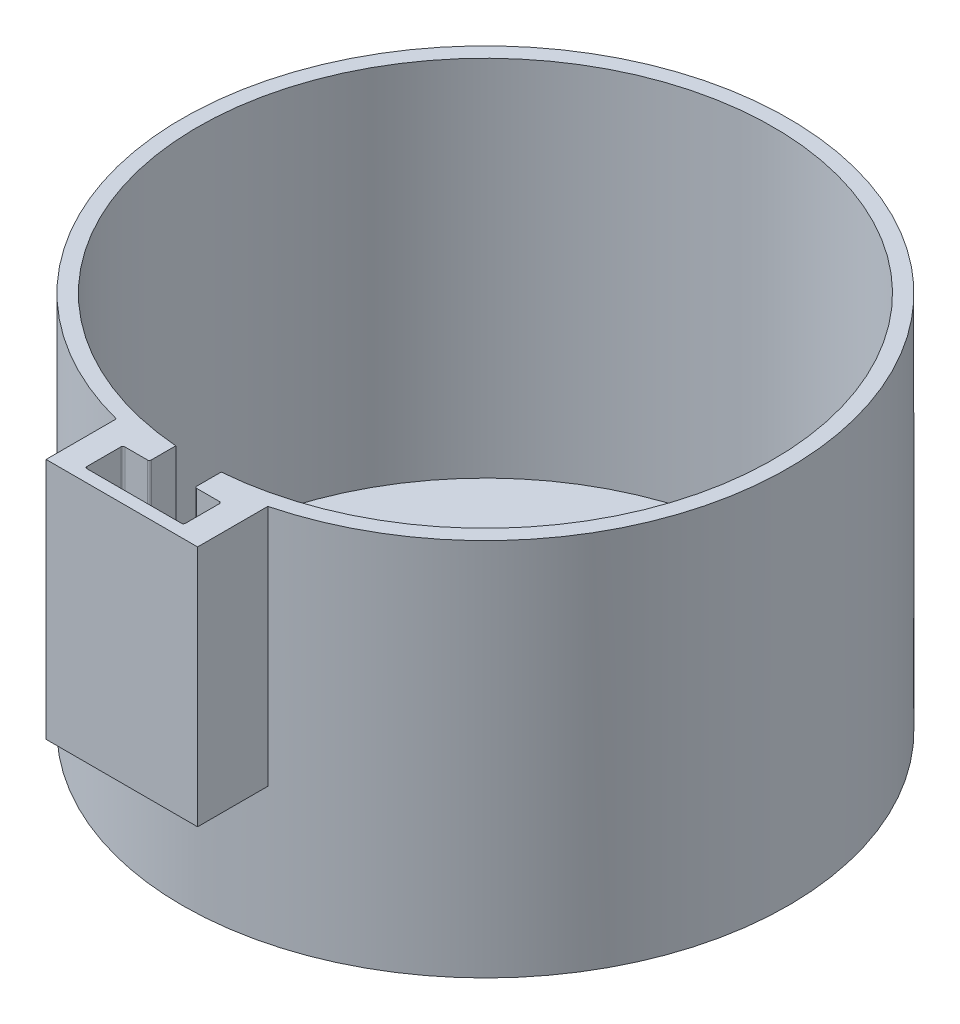
ISO-10303-21;
HEADER;
FILE_DESCRIPTION(('STEP AP214'),'2;1');
FILE_NAME('part.step','',(''),(''),'','','');
FILE_SCHEMA(('AUTOMOTIVE_DESIGN { 1 0 10303 214 1 1 1 1 }'));
ENDSEC;
DATA;
#1=APPLICATION_CONTEXT('core data for automotive mechanical design processes');
#2=APPLICATION_PROTOCOL_DEFINITION('international standard','automotive_design',2000,#1);
#3=PRODUCT_CONTEXT('',#1,'mechanical');
#4=PRODUCT('Part','Part','',(#3));
#5=PRODUCT_RELATED_PRODUCT_CATEGORY('part','',(#4));
#6=PRODUCT_DEFINITION_FORMATION('','',#4);
#7=PRODUCT_DEFINITION_CONTEXT('part definition',#1,'design');
#8=PRODUCT_DEFINITION('design','',#6,#7);
#9=PRODUCT_DEFINITION_SHAPE('','',#8);
#10=(LENGTH_UNIT() NAMED_UNIT(*) SI_UNIT(.MILLI.,.METRE.));
#11=(NAMED_UNIT(*) PLANE_ANGLE_UNIT() SI_UNIT($,.RADIAN.));
#12=(NAMED_UNIT(*) SI_UNIT($,.STERADIAN.) SOLID_ANGLE_UNIT());
#13=UNCERTAINTY_MEASURE_WITH_UNIT(LENGTH_MEASURE(1.E-05),#10,'distance_accuracy_value','');
#14=(GEOMETRIC_REPRESENTATION_CONTEXT(3) GLOBAL_UNCERTAINTY_ASSIGNED_CONTEXT((#13)) GLOBAL_UNIT_ASSIGNED_CONTEXT((#10,
#11,#12)) REPRESENTATION_CONTEXT('',''));
#15=CARTESIAN_POINT('',(0.,0.,0.));
#16=DIRECTION('',(0.,0.,1.));
#17=DIRECTION('',(1.,0.,0.));
#18=AXIS2_PLACEMENT_3D('',#15,#16,#17);
#19=CARTESIAN_POINT('',(0.,40.,0.));
#20=DIRECTION('',(0.,-1.,0.));
#21=DIRECTION('',(0.,0.,-1.));
#22=AXIS2_PLACEMENT_3D('',#19,#20,#21);
#23=CYLINDRICAL_SURFACE('',#22,40.);
#24=CARTESIAN_POINT('',(0.,0.,0.));
#25=DIRECTION('',(0.,1.,0.));
#26=DIRECTION('',(0.,0.,1.));
#27=AXIS2_PLACEMENT_3D('',#24,#25,#26);
#28=CIRCLE('',#27,40.);
#29=CARTESIAN_POINT('',(0.,0.,40.));
#30=VERTEX_POINT('',#29);
#31=EDGE_CURVE('E261',#30,#30,#28,.T.);
#32=ORIENTED_EDGE('',*,*,#31,.T.);
#33=EDGE_LOOP('',(#32));
#34=FACE_BOUND('',#33,.T.);
#35=DIRECTION('',(0.,-1.,0.));
#36=VECTOR('',#35,1.);
#37=CARTESIAN_POINT('',(10.,40.,38.7298334620742));
#38=LINE('',#37,#36);
#39=CARTESIAN_POINT('',(10.,18.,38.7298334620742));
#40=VERTEX_POINT('',#39);
#41=CARTESIAN_POINT('',(10.,50.,38.7298334620742));
#42=VERTEX_POINT('',#41);
#43=EDGE_CURVE('E228',#40,#42,#38,.F.);
#44=ORIENTED_EDGE('',*,*,#43,.F.);
#45=CARTESIAN_POINT('',(0.,18.,0.));
#46=DIRECTION('',(0.,-1.,0.));
#47=DIRECTION('',(0.,0.,-1.));
#48=AXIS2_PLACEMENT_3D('',#45,#46,#47);
#49=CIRCLE('',#48,40.);
#50=CARTESIAN_POINT('',(-9.99999999999999,18.,38.7298334620742));
#51=VERTEX_POINT('',#50);
#52=EDGE_CURVE('E220',#40,#51,#49,.T.);
#53=ORIENTED_EDGE('',*,*,#52,.T.);
#54=DIRECTION('',(0.,-1.,0.));
#55=VECTOR('',#54,1.);
#56=CARTESIAN_POINT('',(-9.99999999999999,40.,38.7298334620742));
#57=LINE('',#56,#55);
#58=CARTESIAN_POINT('',(-9.99999999999999,50.,38.7298334620742));
#59=VERTEX_POINT('',#58);
#60=EDGE_CURVE('E443',#51,#59,#57,.F.);
#61=ORIENTED_EDGE('',*,*,#60,.T.);
#62=CARTESIAN_POINT('',(0.,50.,0.));
#63=DIRECTION('',(0.,1.,0.));
#64=DIRECTION('',(0.,0.,1.));
#65=AXIS2_PLACEMENT_3D('',#62,#63,#64);
#66=CIRCLE('',#65,40.);
#67=EDGE_CURVE('E219',#42,#59,#66,.T.);
#68=ORIENTED_EDGE('',*,*,#67,.F.);
#69=EDGE_LOOP('',(#44,#53,#61,#68));
#70=FACE_BOUND('',#69,.T.);
#71=ADVANCED_FACE('F45',(#34,#70),#23,.T.);
#72=CARTESIAN_POINT('',(0.,0.,0.));
#73=DIRECTION('',(0.,1.,0.));
#74=DIRECTION('',(0.,0.,1.));
#75=AXIS2_PLACEMENT_3D('',#72,#73,#74);
#76=PLANE('',#75);
#77=CARTESIAN_POINT('',(-30.,0.,0.));
#78=DIRECTION('',(0.,-1.,0.));
#79=DIRECTION('',(0.,0.,-1.));
#80=AXIS2_PLACEMENT_3D('',#77,#78,#79);
#81=CIRCLE('',#80,3.);
#82=CARTESIAN_POINT('',(-30.,0.,-3.));
#83=VERTEX_POINT('',#82);
#84=EDGE_CURVE('E357',#83,#83,#81,.T.);
#85=ORIENTED_EDGE('',*,*,#84,.F.);
#86=EDGE_LOOP('',(#85));
#87=FACE_BOUND('',#86,.T.);
#88=CARTESIAN_POINT('',(30.,0.,0.));
#89=DIRECTION('',(0.,-1.,0.));
#90=DIRECTION('',(0.,0.,-1.));
#91=AXIS2_PLACEMENT_3D('',#88,#89,#90);
#92=CIRCLE('',#91,3.);
#93=CARTESIAN_POINT('',(30.,0.,-3.));
#94=VERTEX_POINT('',#93);
#95=EDGE_CURVE('E365',#94,#94,#92,.T.);
#96=ORIENTED_EDGE('',*,*,#95,.F.);
#97=EDGE_LOOP('',(#96));
#98=FACE_BOUND('',#97,.T.);
#99=CARTESIAN_POINT('',(-20.,0.,0.));
#100=DIRECTION('',(0.,1.,0.));
#101=DIRECTION('',(0.,0.,1.));
#102=AXIS2_PLACEMENT_3D('',#99,#100,#101);
#103=CIRCLE('',#102,2.);
#104=CARTESIAN_POINT('',(-20.,0.,2.));
#105=VERTEX_POINT('',#104);
#106=EDGE_CURVE('E277',#105,#105,#103,.F.);
#107=ORIENTED_EDGE('',*,*,#106,.F.);
#108=EDGE_LOOP('',(#107));
#109=FACE_BOUND('',#108,.T.);
#110=CARTESIAN_POINT('',(20.,0.,0.));
#111=DIRECTION('',(0.,1.,0.));
#112=DIRECTION('',(0.,0.,1.));
#113=AXIS2_PLACEMENT_3D('',#110,#111,#112);
#114=CIRCLE('',#113,2.);
#115=CARTESIAN_POINT('',(20.,0.,2.));
#116=VERTEX_POINT('',#115);
#117=EDGE_CURVE('E273',#116,#116,#114,.F.);
#118=ORIENTED_EDGE('',*,*,#117,.F.);
#119=EDGE_LOOP('',(#118));
#120=FACE_BOUND('',#119,.T.);
#121=CARTESIAN_POINT('',(0.,0.,0.));
#122=DIRECTION('',(0.,1.,0.));
#123=DIRECTION('',(0.,0.,1.));
#124=AXIS2_PLACEMENT_3D('',#121,#122,#123);
#125=CIRCLE('',#124,5.);
#126=CARTESIAN_POINT('',(0.,0.,5.));
#127=VERTEX_POINT('',#126);
#128=EDGE_CURVE('E243',#127,#127,#125,.T.);
#129=ORIENTED_EDGE('',*,*,#128,.T.);
#130=EDGE_LOOP('',(#129));
#131=FACE_BOUND('',#130,.T.);
#132=CARTESIAN_POINT('',(0.,0.,39.1212194390183));
#133=DIRECTION('',(0.,1.,0.));
#134=DIRECTION('',(0.,0.,1.));
#135=AXIS2_PLACEMENT_3D('',#132,#133,#134);
#136=CIRCLE('',#135,14.5863569862894);
#137=CARTESIAN_POINT('',(14.0760667026475,0.,35.296803625578));
#138=VERTEX_POINT('',#137);
#139=CARTESIAN_POINT('',(-14.0760667026475,0.,35.296803625578));
#140=VERTEX_POINT('',#139);
#141=EDGE_CURVE('E265',#138,#140,#136,.T.);
#142=ORIENTED_EDGE('',*,*,#141,.T.);
#143=CARTESIAN_POINT('',(0.,0.,4.02455846426619E-13));
#144=DIRECTION('',(0.,1.,0.));
#145=DIRECTION('',(0.,0.,1.));
#146=AXIS2_PLACEMENT_3D('',#143,#144,#145);
#147=CIRCLE('',#146,37.9999999999996);
#148=EDGE_CURVE('E269',#140,#138,#147,.T.);
#149=ORIENTED_EDGE('',*,*,#148,.T.);
#150=EDGE_LOOP('',(#142,#149));
#151=FACE_BOUND('',#150,.T.);
#152=ORIENTED_EDGE('',*,*,#31,.F.);
#153=EDGE_LOOP('',(#152));
#154=FACE_BOUND('',#153,.T.);
#155=ADVANCED_FACE('F476',(#87,#98,#109,#120,#131,#151,#154),#76,.F.);
#156=CARTESIAN_POINT('',(0.,2.,0.));
#157=DIRECTION('',(0.,1.,0.));
#158=DIRECTION('',(0.,0.,1.));
#159=AXIS2_PLACEMENT_3D('',#156,#157,#158);
#160=CYLINDRICAL_SURFACE('',#159,38.);
#161=CARTESIAN_POINT('',(0.,50.,0.));
#162=DIRECTION('',(0.,1.,0.));
#163=DIRECTION('',(0.,0.,1.));
#164=AXIS2_PLACEMENT_3D('',#161,#162,#163);
#165=CIRCLE('',#164,38.);
#166=CARTESIAN_POINT('',(3.,50.,37.8813938497516));
#167=VERTEX_POINT('',#166);
#168=CARTESIAN_POINT('',(-3.,50.,37.8813938497516));
#169=VERTEX_POINT('',#168);
#170=EDGE_CURVE('E206',#167,#169,#165,.T.);
#171=ORIENTED_EDGE('',*,*,#170,.T.);
#172=DIRECTION('',(0.,1.,0.));
#173=VECTOR('',#172,1.);
#174=CARTESIAN_POINT('',(-3.,2.,37.8813938497516));
#175=LINE('',#174,#173);
#176=CARTESIAN_POINT('',(-3.,20.,37.8813938497516));
#177=VERTEX_POINT('',#176);
#178=EDGE_CURVE('E209',#169,#177,#175,.F.);
#179=ORIENTED_EDGE('',*,*,#178,.T.);
#180=CARTESIAN_POINT('',(0.,20.,0.));
#181=DIRECTION('',(0.,-1.,0.));
#182=DIRECTION('',(0.,0.,-1.));
#183=AXIS2_PLACEMENT_3D('',#180,#181,#182);
#184=CIRCLE('',#183,38.);
#185=CARTESIAN_POINT('',(3.,20.,37.8813938497516));
#186=VERTEX_POINT('',#185);
#187=EDGE_CURVE('E207',#177,#186,#184,.F.);
#188=ORIENTED_EDGE('',*,*,#187,.T.);
#189=DIRECTION('',(0.,1.,0.));
#190=VECTOR('',#189,1.);
#191=CARTESIAN_POINT('',(3.,2.,37.8813938497516));
#192=LINE('',#191,#190);
#193=EDGE_CURVE('E191',#186,#167,#192,.T.);
#194=ORIENTED_EDGE('',*,*,#193,.T.);
#195=EDGE_LOOP('',(#171,#179,#188,#194));
#196=FACE_BOUND('',#195,.T.);
#197=CARTESIAN_POINT('',(0.,2.,0.));
#198=DIRECTION('',(0.,1.,0.));
#199=DIRECTION('',(0.,0.,1.));
#200=AXIS2_PLACEMENT_3D('',#197,#198,#199);
#201=CIRCLE('',#200,38.);
#202=CARTESIAN_POINT('',(14.0760667026475,2.,35.296803625578));
#203=VERTEX_POINT('',#202);
#204=CARTESIAN_POINT('',(-14.0760667026475,2.,35.296803625578));
#205=VERTEX_POINT('',#204);
#206=EDGE_CURVE('E255',#203,#205,#201,.T.);
#207=ORIENTED_EDGE('',*,*,#206,.F.);
#208=DIRECTION('',(0.,1.,0.));
#209=VECTOR('',#208,1.);
#210=CARTESIAN_POINT('',(14.0760667026475,-36.,35.296803625578));
#211=LINE('',#210,#209);
#212=EDGE_CURVE('E251',#138,#203,#211,.T.);
#213=ORIENTED_EDGE('',*,*,#212,.F.);
#214=ORIENTED_EDGE('',*,*,#148,.F.);
#215=DIRECTION('',(0.,1.,0.));
#216=VECTOR('',#215,1.);
#217=CARTESIAN_POINT('',(-14.0760667026475,-36.,35.296803625578));
#218=LINE('',#217,#216);
#219=EDGE_CURVE('E252',#140,#205,#218,.T.);
#220=ORIENTED_EDGE('',*,*,#219,.T.);
#221=EDGE_LOOP('',(#207,#213,#214,#220));
#222=FACE_BOUND('',#221,.T.);
#223=ADVANCED_FACE('F203',(#196,#222),#160,.F.);
#224=CARTESIAN_POINT('',(0.,2.,0.));
#225=DIRECTION('',(0.,1.,0.));
#226=DIRECTION('',(0.,0.,1.));
#227=AXIS2_PLACEMENT_3D('',#224,#225,#226);
#228=PLANE('',#227);
#229=CARTESIAN_POINT('',(-30.,2.,0.));
#230=DIRECTION('',(0.,1.,0.));
#231=DIRECTION('',(0.,0.,1.));
#232=AXIS2_PLACEMENT_3D('',#229,#230,#231);
#233=CIRCLE('',#232,3.);
#234=CARTESIAN_POINT('',(-30.,2.,3.));
#235=VERTEX_POINT('',#234);
#236=EDGE_CURVE('E49',#235,#235,#233,.T.);
#237=ORIENTED_EDGE('',*,*,#236,.F.);
#238=EDGE_LOOP('',(#237));
#239=FACE_BOUND('',#238,.T.);
#240=CARTESIAN_POINT('',(30.,2.,0.));
#241=DIRECTION('',(0.,1.,0.));
#242=DIRECTION('',(0.,0.,1.));
#243=AXIS2_PLACEMENT_3D('',#240,#241,#242);
#244=CIRCLE('',#243,3.);
#245=CARTESIAN_POINT('',(30.,2.,3.));
#246=VERTEX_POINT('',#245);
#247=EDGE_CURVE('E354',#246,#246,#244,.T.);
#248=ORIENTED_EDGE('',*,*,#247,.F.);
#249=EDGE_LOOP('',(#248));
#250=FACE_BOUND('',#249,.T.);
#251=CARTESIAN_POINT('',(0.,2.,0.));
#252=DIRECTION('',(0.,1.,0.));
#253=DIRECTION('',(0.,0.,1.));
#254=AXIS2_PLACEMENT_3D('',#251,#252,#253);
#255=CIRCLE('',#254,5.);
#256=CARTESIAN_POINT('',(0.,2.,5.));
#257=VERTEX_POINT('',#256);
#258=EDGE_CURVE('E236',#257,#257,#255,.T.);
#259=ORIENTED_EDGE('',*,*,#258,.F.);
#260=EDGE_LOOP('',(#259));
#261=FACE_BOUND('',#260,.T.);
#262=CARTESIAN_POINT('',(0.,2.,39.1212194390183));
#263=DIRECTION('',(0.,1.,0.));
#264=DIRECTION('',(0.,0.,-1.));
#265=AXIS2_PLACEMENT_3D('',#262,#263,#264);
#266=CIRCLE('',#265,14.5863569862894);
#267=EDGE_CURVE('E247',#203,#205,#266,.T.);
#268=ORIENTED_EDGE('',*,*,#267,.F.);
#269=ORIENTED_EDGE('',*,*,#206,.T.);
#270=EDGE_LOOP('',(#268,#269));
#271=FACE_BOUND('',#270,.T.);
#272=ADVANCED_FACE('F587',(#239,#250,#261,#271),#228,.T.);
#273=CARTESIAN_POINT('',(0.,-36.,39.1212194390183));
#274=DIRECTION('',(0.,1.,0.));
#275=DIRECTION('',(0.,0.,1.));
#276=AXIS2_PLACEMENT_3D('',#273,#274,#275);
#277=CYLINDRICAL_SURFACE('',#276,14.5863569862894);
#278=ORIENTED_EDGE('',*,*,#212,.T.);
#279=ORIENTED_EDGE('',*,*,#267,.T.);
#280=ORIENTED_EDGE('',*,*,#219,.F.);
#281=ORIENTED_EDGE('',*,*,#141,.F.);
#282=EDGE_LOOP('',(#278,#279,#280,#281));
#283=FACE_BOUND('',#282,.T.);
#284=ADVANCED_FACE('F583',(#283),#277,.F.);
#285=CARTESIAN_POINT('',(0.,-36.,0.));
#286=DIRECTION('',(0.,1.,0.));
#287=DIRECTION('',(0.,0.,1.));
#288=AXIS2_PLACEMENT_3D('',#285,#286,#287);
#289=CYLINDRICAL_SURFACE('',#288,5.);
#290=ORIENTED_EDGE('',*,*,#258,.T.);
#291=EDGE_LOOP('',(#290));
#292=FACE_BOUND('',#291,.T.);
#293=ORIENTED_EDGE('',*,*,#128,.F.);
#294=EDGE_LOOP('',(#293));
#295=FACE_BOUND('',#294,.T.);
#296=ADVANCED_FACE('F576',(#292,#295),#289,.F.);
#297=CARTESIAN_POINT('',(20.,-2.,0.));
#298=DIRECTION('',(0.,1.,0.));
#299=DIRECTION('',(0.,0.,1.));
#300=AXIS2_PLACEMENT_3D('',#297,#298,#299);
#301=CYLINDRICAL_SURFACE('',#300,2.);
#302=CARTESIAN_POINT('',(20.,-2.,0.));
#303=DIRECTION('',(0.,-1.,0.));
#304=DIRECTION('',(0.,0.,-1.));
#305=AXIS2_PLACEMENT_3D('',#302,#303,#304);
#306=CIRCLE('',#305,2.);
#307=CARTESIAN_POINT('',(20.,-2.,-2.));
#308=VERTEX_POINT('',#307);
#309=EDGE_CURVE('E225',#308,#308,#306,.T.);
#310=ORIENTED_EDGE('',*,*,#309,.F.);
#311=EDGE_LOOP('',(#310));
#312=FACE_BOUND('',#311,.T.);
#313=ORIENTED_EDGE('',*,*,#117,.T.);
#314=EDGE_LOOP('',(#313));
#315=FACE_BOUND('',#314,.T.);
#316=ADVANCED_FACE('F573',(#312,#315),#301,.T.);
#317=CARTESIAN_POINT('',(20.,-2.,0.));
#318=DIRECTION('',(0.,-1.,0.));
#319=DIRECTION('',(0.,0.,-1.));
#320=AXIS2_PLACEMENT_3D('',#317,#318,#319);
#321=PLANE('',#320);
#322=ORIENTED_EDGE('',*,*,#309,.T.);
#323=EDGE_LOOP('',(#322));
#324=FACE_BOUND('',#323,.T.);
#325=ADVANCED_FACE('F571',(#324),#321,.T.);
#326=CARTESIAN_POINT('',(-20.,-2.,0.));
#327=DIRECTION('',(0.,1.,0.));
#328=DIRECTION('',(0.,0.,1.));
#329=AXIS2_PLACEMENT_3D('',#326,#327,#328);
#330=CYLINDRICAL_SURFACE('',#329,2.);
#331=CARTESIAN_POINT('',(-20.,-2.,0.));
#332=DIRECTION('',(0.,-1.,0.));
#333=DIRECTION('',(0.,0.,-1.));
#334=AXIS2_PLACEMENT_3D('',#331,#332,#333);
#335=CIRCLE('',#334,2.);
#336=CARTESIAN_POINT('',(-20.,-2.,-2.));
#337=VERTEX_POINT('',#336);
#338=EDGE_CURVE('E232',#337,#337,#335,.T.);
#339=ORIENTED_EDGE('',*,*,#338,.F.);
#340=EDGE_LOOP('',(#339));
#341=FACE_BOUND('',#340,.T.);
#342=ORIENTED_EDGE('',*,*,#106,.T.);
#343=EDGE_LOOP('',(#342));
#344=FACE_BOUND('',#343,.T.);
#345=ADVANCED_FACE('F565',(#341,#344),#330,.T.);
#346=CARTESIAN_POINT('',(-20.,-2.,0.));
#347=DIRECTION('',(0.,-1.,0.));
#348=DIRECTION('',(0.,0.,-1.));
#349=AXIS2_PLACEMENT_3D('',#346,#347,#348);
#350=PLANE('',#349);
#351=ORIENTED_EDGE('',*,*,#338,.T.);
#352=EDGE_LOOP('',(#351));
#353=FACE_BOUND('',#352,.T.);
#354=ADVANCED_FACE('F559',(#353),#350,.T.);
#355=CARTESIAN_POINT('',(0.,50.,0.));
#356=DIRECTION('',(0.,1.,0.));
#357=DIRECTION('',(0.,0.,1.));
#358=AXIS2_PLACEMENT_3D('',#355,#356,#357);
#359=PLANE('',#358);
#360=DIRECTION('',(-1.,0.,0.));
#361=VECTOR('',#360,1.);
#362=CARTESIAN_POINT('',(-3.,50.,41.3649167310371));
#363=LINE('',#362,#361);
#364=CARTESIAN_POINT('',(-3.25,50.,41.3649167310371));
#365=VERTEX_POINT('',#364);
#366=CARTESIAN_POINT('',(-6.25,50.,41.3649167310371));
#367=VERTEX_POINT('',#366);
#368=EDGE_CURVE('E198',#365,#367,#363,.T.);
#369=ORIENTED_EDGE('',*,*,#368,.F.);
#370=CARTESIAN_POINT('',(-3.25,50.,41.1149167310371));
#371=DIRECTION('',(0.,1.,0.));
#372=DIRECTION('',(0.,0.,1.));
#373=AXIS2_PLACEMENT_3D('',#370,#371,#372);
#374=CIRCLE('',#373,0.25);
#375=CARTESIAN_POINT('',(-3.,50.,41.1149167310371));
#376=VERTEX_POINT('',#375);
#377=EDGE_CURVE('E295',#365,#376,#374,.T.);
#378=ORIENTED_EDGE('',*,*,#377,.T.);
#379=DIRECTION('',(0.,0.,1.));
#380=VECTOR('',#379,1.);
#381=CARTESIAN_POINT('',(-3.,50.,0.));
#382=LINE('',#381,#380);
#383=EDGE_CURVE('E217',#169,#376,#382,.T.);
#384=ORIENTED_EDGE('',*,*,#383,.F.);
#385=ORIENTED_EDGE('',*,*,#170,.F.);
#386=DIRECTION('',(0.,0.,-1.));
#387=VECTOR('',#386,1.);
#388=CARTESIAN_POINT('',(3.,50.,36.8649167310371));
#389=LINE('',#388,#387);
#390=CARTESIAN_POINT('',(3.,50.,41.1149167310371));
#391=VERTEX_POINT('',#390);
#392=EDGE_CURVE('E187',#391,#167,#389,.T.);
#393=ORIENTED_EDGE('',*,*,#392,.F.);
#394=CARTESIAN_POINT('',(3.25,50.,41.1149167310371));
#395=DIRECTION('',(0.,1.,0.));
#396=DIRECTION('',(0.,0.,1.));
#397=AXIS2_PLACEMENT_3D('',#394,#395,#396);
#398=CIRCLE('',#397,0.25);
#399=CARTESIAN_POINT('',(3.25,50.,41.3649167310371));
#400=VERTEX_POINT('',#399);
#401=EDGE_CURVE('E292',#391,#400,#398,.T.);
#402=ORIENTED_EDGE('',*,*,#401,.T.);
#403=DIRECTION('',(-1.,0.,0.));
#404=VECTOR('',#403,1.);
#405=CARTESIAN_POINT('',(3.,50.,41.3649167310371));
#406=LINE('',#405,#404);
#407=CARTESIAN_POINT('',(6.25,50.,41.3649167310371));
#408=VERTEX_POINT('',#407);
#409=EDGE_CURVE('E199',#408,#400,#406,.T.);
#410=ORIENTED_EDGE('',*,*,#409,.F.);
#411=CARTESIAN_POINT('',(6.25,50.,41.6149167310371));
#412=DIRECTION('',(0.,1.,0.));
#413=DIRECTION('',(0.,0.,1.));
#414=AXIS2_PLACEMENT_3D('',#411,#412,#413);
#415=CIRCLE('',#414,0.25);
#416=CARTESIAN_POINT('',(6.5,50.,41.6149167310371));
#417=VERTEX_POINT('',#416);
#418=EDGE_CURVE('E347',#408,#417,#415,.F.);
#419=ORIENTED_EDGE('',*,*,#418,.T.);
#420=DIRECTION('',(0.,0.,-1.));
#421=VECTOR('',#420,1.);
#422=CARTESIAN_POINT('',(6.5,50.,41.3649167310371));
#423=LINE('',#422,#421);
#424=CARTESIAN_POINT('',(6.50000000000001,50.,46.1149167310371));
#425=VERTEX_POINT('',#424);
#426=EDGE_CURVE('E400',#425,#417,#423,.T.);
#427=ORIENTED_EDGE('',*,*,#426,.F.);
#428=CARTESIAN_POINT('',(6.25,50.,46.1149167310371));
#429=DIRECTION('',(0.,1.,0.));
#430=DIRECTION('',(0.,0.,1.));
#431=AXIS2_PLACEMENT_3D('',#428,#429,#430);
#432=CIRCLE('',#431,0.25);
#433=CARTESIAN_POINT('',(6.25,50.,46.3649167310371));
#434=VERTEX_POINT('',#433);
#435=EDGE_CURVE('E55',#425,#434,#432,.F.);
#436=ORIENTED_EDGE('',*,*,#435,.T.);
#437=DIRECTION('',(1.,0.,0.));
#438=VECTOR('',#437,1.);
#439=CARTESIAN_POINT('',(-6.5,50.,46.3649167310371));
#440=LINE('',#439,#438);
#441=CARTESIAN_POINT('',(-6.25,50.,46.3649167310371));
#442=VERTEX_POINT('',#441);
#443=EDGE_CURVE('E363',#442,#434,#440,.T.);
#444=ORIENTED_EDGE('',*,*,#443,.F.);
#445=CARTESIAN_POINT('',(-6.25,50.,46.1149167310371));
#446=DIRECTION('',(0.,1.,0.));
#447=DIRECTION('',(0.,0.,1.));
#448=AXIS2_PLACEMENT_3D('',#445,#446,#447);
#449=CIRCLE('',#448,0.25);
#450=CARTESIAN_POINT('',(-6.5,50.,46.1149167310371));
#451=VERTEX_POINT('',#450);
#452=EDGE_CURVE('E11',#442,#451,#449,.F.);
#453=ORIENTED_EDGE('',*,*,#452,.T.);
#454=DIRECTION('',(0.,0.,1.));
#455=VECTOR('',#454,1.);
#456=CARTESIAN_POINT('',(-6.5,50.,41.3649167310371));
#457=LINE('',#456,#455);
#458=CARTESIAN_POINT('',(-6.5,50.,41.6149167310371));
#459=VERTEX_POINT('',#458);
#460=EDGE_CURVE('E377',#459,#451,#457,.T.);
#461=ORIENTED_EDGE('',*,*,#460,.F.);
#462=CARTESIAN_POINT('',(-6.25,50.,41.6149167310371));
#463=DIRECTION('',(0.,1.,0.));
#464=DIRECTION('',(0.,0.,1.));
#465=AXIS2_PLACEMENT_3D('',#462,#463,#464);
#466=CIRCLE('',#465,0.25);
#467=EDGE_CURVE('E350',#459,#367,#466,.F.);
#468=ORIENTED_EDGE('',*,*,#467,.T.);
#469=EDGE_LOOP('',(#369,#378,#384,#385,#393,#402,#410,#419,#427,#436,#444,#453,#461,#468));
#470=FACE_BOUND('',#469,.T.);
#471=ORIENTED_EDGE('',*,*,#67,.T.);
#472=DIRECTION('',(0.,0.,1.));
#473=VECTOR('',#472,1.);
#474=CARTESIAN_POINT('',(-9.99999999999999,50.,38.));
#475=LINE('',#474,#473);
#476=CARTESIAN_POINT('',(-9.99999999999999,50.,48.));
#477=VERTEX_POINT('',#476);
#478=EDGE_CURVE('E420',#59,#477,#475,.T.);
#479=ORIENTED_EDGE('',*,*,#478,.T.);
#480=DIRECTION('',(1.,0.,0.));
#481=VECTOR('',#480,1.);
#482=CARTESIAN_POINT('',(-9.99999999999999,50.,48.));
#483=LINE('',#482,#481);
#484=CARTESIAN_POINT('',(10.,50.,48.));
#485=VERTEX_POINT('',#484);
#486=EDGE_CURVE('E430',#477,#485,#483,.T.);
#487=ORIENTED_EDGE('',*,*,#486,.T.);
#488=DIRECTION('',(0.,0.,1.));
#489=VECTOR('',#488,1.);
#490=CARTESIAN_POINT('',(10.,50.,38.));
#491=LINE('',#490,#489);
#492=EDGE_CURVE('E415',#42,#485,#491,.T.);
#493=ORIENTED_EDGE('',*,*,#492,.F.);
#494=EDGE_LOOP('',(#471,#479,#487,#493));
#495=FACE_BOUND('',#494,.T.);
#496=ADVANCED_FACE('F214',(#470,#495),#359,.T.);
#497=CARTESIAN_POINT('',(0.,18.,0.));
#498=DIRECTION('',(0.,-1.,0.));
#499=DIRECTION('',(0.,0.,-1.));
#500=AXIS2_PLACEMENT_3D('',#497,#498,#499);
#501=PLANE('',#500);
#502=ORIENTED_EDGE('',*,*,#52,.F.);
#503=DIRECTION('',(0.,0.,1.));
#504=VECTOR('',#503,1.);
#505=CARTESIAN_POINT('',(10.,18.,38.));
#506=LINE('',#505,#504);
#507=CARTESIAN_POINT('',(10.,18.,48.));
#508=VERTEX_POINT('',#507);
#509=EDGE_CURVE('E416',#40,#508,#506,.T.);
#510=ORIENTED_EDGE('',*,*,#509,.T.);
#511=DIRECTION('',(1.,0.,0.));
#512=VECTOR('',#511,1.);
#513=CARTESIAN_POINT('',(-9.99999999999999,18.,48.));
#514=LINE('',#513,#512);
#515=CARTESIAN_POINT('',(-9.99999999999999,18.,48.));
#516=VERTEX_POINT('',#515);
#517=EDGE_CURVE('E419',#516,#508,#514,.T.);
#518=ORIENTED_EDGE('',*,*,#517,.F.);
#519=DIRECTION('',(0.,0.,1.));
#520=VECTOR('',#519,1.);
#521=CARTESIAN_POINT('',(-9.99999999999999,18.,38.));
#522=LINE('',#521,#520);
#523=EDGE_CURVE('E424',#51,#516,#522,.T.);
#524=ORIENTED_EDGE('',*,*,#523,.F.);
#525=EDGE_LOOP('',(#502,#510,#518,#524));
#526=FACE_BOUND('',#525,.T.);
#527=ADVANCED_FACE('F462',(#526),#501,.T.);
#528=CARTESIAN_POINT('',(10.,18.,38.));
#529=DIRECTION('',(-1.,0.,0.));
#530=DIRECTION('',(0.,0.,1.));
#531=AXIS2_PLACEMENT_3D('',#528,#529,#530);
#532=PLANE('',#531);
#533=ORIENTED_EDGE('',*,*,#509,.F.);
#534=ORIENTED_EDGE('',*,*,#43,.T.);
#535=ORIENTED_EDGE('',*,*,#492,.T.);
#536=DIRECTION('',(0.,1.,0.));
#537=VECTOR('',#536,1.);
#538=CARTESIAN_POINT('',(10.,18.,48.));
#539=LINE('',#538,#537);
#540=EDGE_CURVE('E439',#508,#485,#539,.T.);
#541=ORIENTED_EDGE('',*,*,#540,.F.);
#542=EDGE_LOOP('',(#533,#534,#535,#541));
#543=FACE_BOUND('',#542,.T.);
#544=ADVANCED_FACE('F452',(#543),#532,.F.);
#545=CARTESIAN_POINT('',(-9.99999999999999,18.,38.));
#546=DIRECTION('',(-1.,0.,0.));
#547=DIRECTION('',(0.,0.,1.));
#548=AXIS2_PLACEMENT_3D('',#545,#546,#547);
#549=PLANE('',#548);
#550=ORIENTED_EDGE('',*,*,#60,.F.);
#551=ORIENTED_EDGE('',*,*,#523,.T.);
#552=DIRECTION('',(0.,1.,0.));
#553=VECTOR('',#552,1.);
#554=CARTESIAN_POINT('',(-9.99999999999999,18.,48.));
#555=LINE('',#554,#553);
#556=EDGE_CURVE('E427',#516,#477,#555,.T.);
#557=ORIENTED_EDGE('',*,*,#556,.T.);
#558=ORIENTED_EDGE('',*,*,#478,.F.);
#559=EDGE_LOOP('',(#550,#551,#557,#558));
#560=FACE_BOUND('',#559,.T.);
#561=ADVANCED_FACE('F464',(#560),#549,.T.);
#562=CARTESIAN_POINT('',(-9.99999999999999,18.,48.));
#563=DIRECTION('',(0.,0.,1.));
#564=DIRECTION('',(1.,0.,0.));
#565=AXIS2_PLACEMENT_3D('',#562,#563,#564);
#566=PLANE('',#565);
#567=ORIENTED_EDGE('',*,*,#486,.F.);
#568=ORIENTED_EDGE('',*,*,#556,.F.);
#569=ORIENTED_EDGE('',*,*,#517,.T.);
#570=ORIENTED_EDGE('',*,*,#540,.T.);
#571=EDGE_LOOP('',(#567,#568,#569,#570));
#572=FACE_BOUND('',#571,.T.);
#573=ADVANCED_FACE('F458',(#572),#566,.T.);
#574=CARTESIAN_POINT('',(0.,20.,0.));
#575=DIRECTION('',(0.,-1.,0.));
#576=DIRECTION('',(0.,0.,-1.));
#577=AXIS2_PLACEMENT_3D('',#574,#575,#576);
#578=PLANE('',#577);
#579=DIRECTION('',(0.,0.,-1.));
#580=VECTOR('',#579,1.);
#581=CARTESIAN_POINT('',(6.5,20.,41.3649167310371));
#582=LINE('',#581,#580);
#583=CARTESIAN_POINT('',(6.50000000000001,20.,46.1149167310371));
#584=VERTEX_POINT('',#583);
#585=CARTESIAN_POINT('',(6.5,20.,41.6149167310371));
#586=VERTEX_POINT('',#585);
#587=EDGE_CURVE('E376',#584,#586,#582,.T.);
#588=ORIENTED_EDGE('',*,*,#587,.T.);
#589=CARTESIAN_POINT('',(6.25,20.,41.6149167310371));
#590=DIRECTION('',(0.,-1.,0.));
#591=DIRECTION('',(0.,0.,-1.));
#592=AXIS2_PLACEMENT_3D('',#589,#590,#591);
#593=CIRCLE('',#592,0.25);
#594=CARTESIAN_POINT('',(6.25,20.,41.3649167310371));
#595=VERTEX_POINT('',#594);
#596=EDGE_CURVE('E325',#586,#595,#593,.F.);
#597=ORIENTED_EDGE('',*,*,#596,.T.);
#598=DIRECTION('',(-1.,0.,0.));
#599=VECTOR('',#598,1.);
#600=CARTESIAN_POINT('',(3.,20.,41.3649167310371));
#601=LINE('',#600,#599);
#602=CARTESIAN_POINT('',(3.25,20.,41.3649167310371));
#603=VERTEX_POINT('',#602);
#604=EDGE_CURVE('E381',#595,#603,#601,.T.);
#605=ORIENTED_EDGE('',*,*,#604,.T.);
#606=CARTESIAN_POINT('',(3.25,20.,41.1149167310371));
#607=DIRECTION('',(0.,-1.,0.));
#608=DIRECTION('',(0.,0.,-1.));
#609=AXIS2_PLACEMENT_3D('',#606,#607,#608);
#610=CIRCLE('',#609,0.25);
#611=CARTESIAN_POINT('',(3.,20.,41.1149167310371));
#612=VERTEX_POINT('',#611);
#613=EDGE_CURVE('E344',#603,#612,#610,.T.);
#614=ORIENTED_EDGE('',*,*,#613,.T.);
#615=DIRECTION('',(0.,0.,-1.));
#616=VECTOR('',#615,1.);
#617=CARTESIAN_POINT('',(3.,20.,36.8649167310371));
#618=LINE('',#617,#616);
#619=EDGE_CURVE('E385',#612,#186,#618,.T.);
#620=ORIENTED_EDGE('',*,*,#619,.T.);
#621=ORIENTED_EDGE('',*,*,#187,.F.);
#622=DIRECTION('',(0.,0.,1.));
#623=VECTOR('',#622,1.);
#624=CARTESIAN_POINT('',(-3.,20.,36.8649167310371));
#625=LINE('',#624,#623);
#626=CARTESIAN_POINT('',(-3.,20.,41.1149167310371));
#627=VERTEX_POINT('',#626);
#628=EDGE_CURVE('E388',#177,#627,#625,.T.);
#629=ORIENTED_EDGE('',*,*,#628,.T.);
#630=CARTESIAN_POINT('',(-3.25,20.,41.1149167310371));
#631=DIRECTION('',(0.,-1.,0.));
#632=DIRECTION('',(0.,0.,-1.));
#633=AXIS2_PLACEMENT_3D('',#630,#631,#632);
#634=CIRCLE('',#633,0.25);
#635=CARTESIAN_POINT('',(-3.25,20.,41.3649167310371));
#636=VERTEX_POINT('',#635);
#637=EDGE_CURVE('E341',#627,#636,#634,.T.);
#638=ORIENTED_EDGE('',*,*,#637,.T.);
#639=DIRECTION('',(-1.,0.,0.));
#640=VECTOR('',#639,1.);
#641=CARTESIAN_POINT('',(-3.,20.,41.3649167310371));
#642=LINE('',#641,#640);
#643=CARTESIAN_POINT('',(-6.25,20.,41.3649167310371));
#644=VERTEX_POINT('',#643);
#645=EDGE_CURVE('E392',#636,#644,#642,.T.);
#646=ORIENTED_EDGE('',*,*,#645,.T.);
#647=CARTESIAN_POINT('',(-6.25,20.,41.6149167310371));
#648=DIRECTION('',(0.,-1.,0.));
#649=DIRECTION('',(0.,0.,-1.));
#650=AXIS2_PLACEMENT_3D('',#647,#648,#649);
#651=CIRCLE('',#650,0.25);
#652=CARTESIAN_POINT('',(-6.5,20.,41.6149167310371));
#653=VERTEX_POINT('',#652);
#654=EDGE_CURVE('E322',#644,#653,#651,.F.);
#655=ORIENTED_EDGE('',*,*,#654,.T.);
#656=DIRECTION('',(0.,0.,1.));
#657=VECTOR('',#656,1.);
#658=CARTESIAN_POINT('',(-6.5,20.,41.3649167310371));
#659=LINE('',#658,#657);
#660=CARTESIAN_POINT('',(-6.5,20.,46.1149167310371));
#661=VERTEX_POINT('',#660);
#662=EDGE_CURVE('E210',#653,#661,#659,.T.);
#663=ORIENTED_EDGE('',*,*,#662,.T.);
#664=CARTESIAN_POINT('',(-6.25,20.,46.1149167310371));
#665=DIRECTION('',(0.,-1.,0.));
#666=DIRECTION('',(0.,0.,-1.));
#667=AXIS2_PLACEMENT_3D('',#664,#665,#666);
#668=CIRCLE('',#667,0.25);
#669=CARTESIAN_POINT('',(-6.25,20.,46.3649167310371));
#670=VERTEX_POINT('',#669);
#671=EDGE_CURVE('E70',#661,#670,#668,.F.);
#672=ORIENTED_EDGE('',*,*,#671,.T.);
#673=DIRECTION('',(1.,0.,0.));
#674=VECTOR('',#673,1.);
#675=CARTESIAN_POINT('',(-6.5,20.,46.3649167310371));
#676=LINE('',#675,#674);
#677=CARTESIAN_POINT('',(6.25,20.,46.3649167310371));
#678=VERTEX_POINT('',#677);
#679=EDGE_CURVE('E373',#670,#678,#676,.T.);
#680=ORIENTED_EDGE('',*,*,#679,.T.);
#681=CARTESIAN_POINT('',(6.25,20.,46.1149167310371));
#682=DIRECTION('',(0.,-1.,0.));
#683=DIRECTION('',(0.,0.,-1.));
#684=AXIS2_PLACEMENT_3D('',#681,#682,#683);
#685=CIRCLE('',#684,0.25);
#686=EDGE_CURVE('E319',#678,#584,#685,.F.);
#687=ORIENTED_EDGE('',*,*,#686,.T.);
#688=EDGE_LOOP('',(#588,#597,#605,#614,#620,#621,#629,#638,#646,#655,#663,#672,#680,#687));
#689=FACE_BOUND('',#688,.T.);
#690=ADVANCED_FACE('F471',(#689),#578,.F.);
#691=CARTESIAN_POINT('',(-3.,20.,36.8649167310371));
#692=DIRECTION('',(-1.,0.,0.));
#693=DIRECTION('',(0.,0.,1.));
#694=AXIS2_PLACEMENT_3D('',#691,#692,#693);
#695=PLANE('',#694);
#696=ORIENTED_EDGE('',*,*,#383,.T.);
#697=DIRECTION('',(0.,1.,0.));
#698=VECTOR('',#697,1.);
#699=CARTESIAN_POINT('',(-3.,20.,41.1149167310371));
#700=LINE('',#699,#698);
#701=EDGE_CURVE('E298',#376,#627,#700,.F.);
#702=ORIENTED_EDGE('',*,*,#701,.T.);
#703=ORIENTED_EDGE('',*,*,#628,.F.);
#704=ORIENTED_EDGE('',*,*,#178,.F.);
#705=EDGE_LOOP('',(#696,#702,#703,#704));
#706=FACE_BOUND('',#705,.T.);
#707=ADVANCED_FACE('F529',(#706),#695,.F.);
#708=CARTESIAN_POINT('',(3.,20.,36.8649167310371));
#709=DIRECTION('',(1.,0.,0.));
#710=DIRECTION('',(0.,0.,-1.));
#711=AXIS2_PLACEMENT_3D('',#708,#709,#710);
#712=PLANE('',#711);
#713=ORIENTED_EDGE('',*,*,#619,.F.);
#714=DIRECTION('',(0.,1.,0.));
#715=VECTOR('',#714,1.);
#716=CARTESIAN_POINT('',(3.,20.,41.1149167310371));
#717=LINE('',#716,#715);
#718=EDGE_CURVE('E194',#612,#391,#717,.T.);
#719=ORIENTED_EDGE('',*,*,#718,.T.);
#720=ORIENTED_EDGE('',*,*,#392,.T.);
#721=ORIENTED_EDGE('',*,*,#193,.F.);
#722=EDGE_LOOP('',(#713,#719,#720,#721));
#723=FACE_BOUND('',#722,.T.);
#724=ADVANCED_FACE('F190',(#723),#712,.F.);
#725=CARTESIAN_POINT('',(-6.5,20.,46.3649167310371));
#726=DIRECTION('',(0.,0.,1.));
#727=DIRECTION('',(1.,0.,0.));
#728=AXIS2_PLACEMENT_3D('',#725,#726,#727);
#729=PLANE('',#728);
#730=ORIENTED_EDGE('',*,*,#443,.T.);
#731=DIRECTION('',(0.,1.,0.));
#732=VECTOR('',#731,1.);
#733=CARTESIAN_POINT('',(6.25,20.,46.3649167310371));
#734=LINE('',#733,#732);
#735=EDGE_CURVE('E63',#434,#678,#734,.F.);
#736=ORIENTED_EDGE('',*,*,#735,.T.);
#737=ORIENTED_EDGE('',*,*,#679,.F.);
#738=DIRECTION('',(0.,1.,0.));
#739=VECTOR('',#738,1.);
#740=CARTESIAN_POINT('',(-6.25,50.,46.3649167310371));
#741=LINE('',#740,#739);
#742=EDGE_CURVE('E335',#670,#442,#741,.T.);
#743=ORIENTED_EDGE('',*,*,#742,.T.);
#744=EDGE_LOOP('',(#730,#736,#737,#743));
#745=FACE_BOUND('',#744,.T.);
#746=ADVANCED_FACE('F545',(#745),#729,.F.);
#747=CARTESIAN_POINT('',(-6.5,20.,41.3649167310371));
#748=DIRECTION('',(-1.,0.,0.));
#749=DIRECTION('',(0.,0.,1.));
#750=AXIS2_PLACEMENT_3D('',#747,#748,#749);
#751=PLANE('',#750);
#752=ORIENTED_EDGE('',*,*,#662,.F.);
#753=DIRECTION('',(0.,1.,0.));
#754=VECTOR('',#753,1.);
#755=CARTESIAN_POINT('',(-6.5,50.,41.6149167310371));
#756=LINE('',#755,#754);
#757=EDGE_CURVE('E331',#653,#459,#756,.T.);
#758=ORIENTED_EDGE('',*,*,#757,.T.);
#759=ORIENTED_EDGE('',*,*,#460,.T.);
#760=DIRECTION('',(0.,1.,0.));
#761=VECTOR('',#760,1.);
#762=CARTESIAN_POINT('',(-6.5,20.,46.1149167310371));
#763=LINE('',#762,#761);
#764=EDGE_CURVE('E328',#451,#661,#763,.F.);
#765=ORIENTED_EDGE('',*,*,#764,.T.);
#766=EDGE_LOOP('',(#752,#758,#759,#765));
#767=FACE_BOUND('',#766,.T.);
#768=ADVANCED_FACE('F540',(#767),#751,.F.);
#769=CARTESIAN_POINT('',(-3.,20.,41.3649167310371));
#770=DIRECTION('',(0.,0.,-1.));
#771=DIRECTION('',(-1.,0.,0.));
#772=AXIS2_PLACEMENT_3D('',#769,#770,#771);
#773=PLANE('',#772);
#774=ORIENTED_EDGE('',*,*,#645,.F.);
#775=DIRECTION('',(0.,1.,0.));
#776=VECTOR('',#775,1.);
#777=CARTESIAN_POINT('',(-3.25,20.,41.3649167310371));
#778=LINE('',#777,#776);
#779=EDGE_CURVE('E288',#636,#365,#778,.T.);
#780=ORIENTED_EDGE('',*,*,#779,.T.);
#781=ORIENTED_EDGE('',*,*,#368,.T.);
#782=DIRECTION('',(0.,1.,0.));
#783=VECTOR('',#782,1.);
#784=CARTESIAN_POINT('',(-6.25,20.,41.3649167310371));
#785=LINE('',#784,#783);
#786=EDGE_CURVE('E285',#367,#644,#785,.F.);
#787=ORIENTED_EDGE('',*,*,#786,.T.);
#788=EDGE_LOOP('',(#774,#780,#781,#787));
#789=FACE_BOUND('',#788,.T.);
#790=ADVANCED_FACE('F535',(#789),#773,.F.);
#791=CARTESIAN_POINT('',(3.,20.,41.3649167310371));
#792=DIRECTION('',(0.,0.,-1.));
#793=DIRECTION('',(-1.,0.,0.));
#794=AXIS2_PLACEMENT_3D('',#791,#792,#793);
#795=PLANE('',#794);
#796=ORIENTED_EDGE('',*,*,#409,.T.);
#797=DIRECTION('',(0.,1.,0.));
#798=VECTOR('',#797,1.);
#799=CARTESIAN_POINT('',(3.25,20.,41.3649167310371));
#800=LINE('',#799,#798);
#801=EDGE_CURVE('E307',#400,#603,#800,.F.);
#802=ORIENTED_EDGE('',*,*,#801,.T.);
#803=ORIENTED_EDGE('',*,*,#604,.F.);
#804=DIRECTION('',(0.,1.,0.));
#805=VECTOR('',#804,1.);
#806=CARTESIAN_POINT('',(6.25,50.,41.3649167310371));
#807=LINE('',#806,#805);
#808=EDGE_CURVE('E303',#595,#408,#807,.T.);
#809=ORIENTED_EDGE('',*,*,#808,.T.);
#810=EDGE_LOOP('',(#796,#802,#803,#809));
#811=FACE_BOUND('',#810,.T.);
#812=ADVANCED_FACE('F523',(#811),#795,.F.);
#813=CARTESIAN_POINT('',(6.5,20.,41.3649167310371));
#814=DIRECTION('',(1.,0.,0.));
#815=DIRECTION('',(0.,0.,-1.));
#816=AXIS2_PLACEMENT_3D('',#813,#814,#815);
#817=PLANE('',#816);
#818=ORIENTED_EDGE('',*,*,#426,.T.);
#819=DIRECTION('',(0.,1.,0.));
#820=VECTOR('',#819,1.);
#821=CARTESIAN_POINT('',(6.5,20.,41.6149167310371));
#822=LINE('',#821,#820);
#823=EDGE_CURVE('E314',#417,#586,#822,.F.);
#824=ORIENTED_EDGE('',*,*,#823,.T.);
#825=ORIENTED_EDGE('',*,*,#587,.F.);
#826=DIRECTION('',(0.,1.,0.));
#827=VECTOR('',#826,1.);
#828=CARTESIAN_POINT('',(6.50000000000001,50.,46.1149167310371));
#829=LINE('',#828,#827);
#830=EDGE_CURVE('E310',#584,#425,#829,.T.);
#831=ORIENTED_EDGE('',*,*,#830,.T.);
#832=EDGE_LOOP('',(#818,#824,#825,#831));
#833=FACE_BOUND('',#832,.T.);
#834=ADVANCED_FACE('F492',(#833),#817,.F.);
#835=CARTESIAN_POINT('',(-3.25,20.,41.1149167310371));
#836=DIRECTION('',(0.,1.,0.));
#837=DIRECTION('',(0.,0.,1.));
#838=AXIS2_PLACEMENT_3D('',#835,#836,#837);
#839=CYLINDRICAL_SURFACE('',#838,0.25);
#840=ORIENTED_EDGE('',*,*,#637,.F.);
#841=ORIENTED_EDGE('',*,*,#701,.F.);
#842=ORIENTED_EDGE('',*,*,#377,.F.);
#843=ORIENTED_EDGE('',*,*,#779,.F.);
#844=EDGE_LOOP('',(#840,#841,#842,#843));
#845=FACE_BOUND('',#844,.T.);
#846=ADVANCED_FACE('F488',(#845),#839,.T.);
#847=CARTESIAN_POINT('',(3.25,20.,41.1149167310371));
#848=DIRECTION('',(0.,1.,0.));
#849=DIRECTION('',(0.,0.,1.));
#850=AXIS2_PLACEMENT_3D('',#847,#848,#849);
#851=CYLINDRICAL_SURFACE('',#850,0.25);
#852=ORIENTED_EDGE('',*,*,#613,.F.);
#853=ORIENTED_EDGE('',*,*,#801,.F.);
#854=ORIENTED_EDGE('',*,*,#401,.F.);
#855=ORIENTED_EDGE('',*,*,#718,.F.);
#856=EDGE_LOOP('',(#852,#853,#854,#855));
#857=FACE_BOUND('',#856,.T.);
#858=ADVANCED_FACE('F491',(#857),#851,.T.);
#859=CARTESIAN_POINT('',(6.25,20.,41.6149167310371));
#860=DIRECTION('',(0.,-1.,0.));
#861=DIRECTION('',(0.,0.,-1.));
#862=AXIS2_PLACEMENT_3D('',#859,#860,#861);
#863=CYLINDRICAL_SURFACE('',#862,0.25);
#864=ORIENTED_EDGE('',*,*,#596,.F.);
#865=ORIENTED_EDGE('',*,*,#823,.F.);
#866=ORIENTED_EDGE('',*,*,#418,.F.);
#867=ORIENTED_EDGE('',*,*,#808,.F.);
#868=EDGE_LOOP('',(#864,#865,#866,#867));
#869=FACE_BOUND('',#868,.T.);
#870=ADVANCED_FACE('F496',(#869),#863,.F.);
#871=CARTESIAN_POINT('',(-6.25,20.,41.6149167310371));
#872=DIRECTION('',(0.,-1.,0.));
#873=DIRECTION('',(0.,0.,-1.));
#874=AXIS2_PLACEMENT_3D('',#871,#872,#873);
#875=CYLINDRICAL_SURFACE('',#874,0.25);
#876=ORIENTED_EDGE('',*,*,#654,.F.);
#877=ORIENTED_EDGE('',*,*,#786,.F.);
#878=ORIENTED_EDGE('',*,*,#467,.F.);
#879=ORIENTED_EDGE('',*,*,#757,.F.);
#880=EDGE_LOOP('',(#876,#877,#878,#879));
#881=FACE_BOUND('',#880,.T.);
#882=ADVANCED_FACE('F500',(#881),#875,.F.);
#883=CARTESIAN_POINT('',(6.25,20.,46.1149167310371));
#884=DIRECTION('',(0.,-1.,0.));
#885=DIRECTION('',(0.,0.,-1.));
#886=AXIS2_PLACEMENT_3D('',#883,#884,#885);
#887=CYLINDRICAL_SURFACE('',#886,0.25);
#888=ORIENTED_EDGE('',*,*,#686,.F.);
#889=ORIENTED_EDGE('',*,*,#735,.F.);
#890=ORIENTED_EDGE('',*,*,#435,.F.);
#891=ORIENTED_EDGE('',*,*,#830,.F.);
#892=EDGE_LOOP('',(#888,#889,#890,#891));
#893=FACE_BOUND('',#892,.T.);
#894=ADVANCED_FACE('F503',(#893),#887,.F.);
#895=CARTESIAN_POINT('',(-6.25,20.,46.1149167310371));
#896=DIRECTION('',(0.,-1.,0.));
#897=DIRECTION('',(0.,0.,-1.));
#898=AXIS2_PLACEMENT_3D('',#895,#896,#897);
#899=CYLINDRICAL_SURFACE('',#898,0.25);
#900=ORIENTED_EDGE('',*,*,#671,.F.);
#901=ORIENTED_EDGE('',*,*,#764,.F.);
#902=ORIENTED_EDGE('',*,*,#452,.F.);
#903=ORIENTED_EDGE('',*,*,#742,.F.);
#904=EDGE_LOOP('',(#900,#901,#902,#903));
#905=FACE_BOUND('',#904,.T.);
#906=ADVANCED_FACE('F47',(#905),#899,.F.);
#907=CARTESIAN_POINT('',(30.,10.,0.));
#908=DIRECTION('',(0.,-1.,0.));
#909=DIRECTION('',(0.,0.,-1.));
#910=AXIS2_PLACEMENT_3D('',#907,#908,#909);
#911=CYLINDRICAL_SURFACE('',#910,3.);
#912=ORIENTED_EDGE('',*,*,#247,.T.);
#913=EDGE_LOOP('',(#912));
#914=FACE_BOUND('',#913,.T.);
#915=ORIENTED_EDGE('',*,*,#95,.T.);
#916=EDGE_LOOP('',(#915));
#917=FACE_BOUND('',#916,.T.);
#918=ADVANCED_FACE('F510',(#914,#917),#911,.F.);
#919=CARTESIAN_POINT('',(-30.,10.,0.));
#920=DIRECTION('',(0.,-1.,0.));
#921=DIRECTION('',(0.,0.,-1.));
#922=AXIS2_PLACEMENT_3D('',#919,#920,#921);
#923=CYLINDRICAL_SURFACE('',#922,3.);
#924=ORIENTED_EDGE('',*,*,#236,.T.);
#925=EDGE_LOOP('',(#924));
#926=FACE_BOUND('',#925,.T.);
#927=ORIENTED_EDGE('',*,*,#84,.T.);
#928=EDGE_LOOP('',(#927));
#929=FACE_BOUND('',#928,.T.);
#930=ADVANCED_FACE('F701',(#926,#929),#923,.F.);
#931=CLOSED_SHELL('',(#71,#155,#223,#272,#284,#296,#316,#325,#345,#354,#496,#527,#544,#561,#573,
#690,#707,#724,#746,#768,#790,#812,#834,#846,#858,#870,#882,#894,#906,#918,#930));
#932=MANIFOLD_SOLID_BREP('B2',#931);
#933=ADVANCED_BREP_SHAPE_REPRESENTATION('',(#18,#932),#14);
#934=SHAPE_DEFINITION_REPRESENTATION(#9,#933);
ENDSEC;
END-ISO-10303-21;
